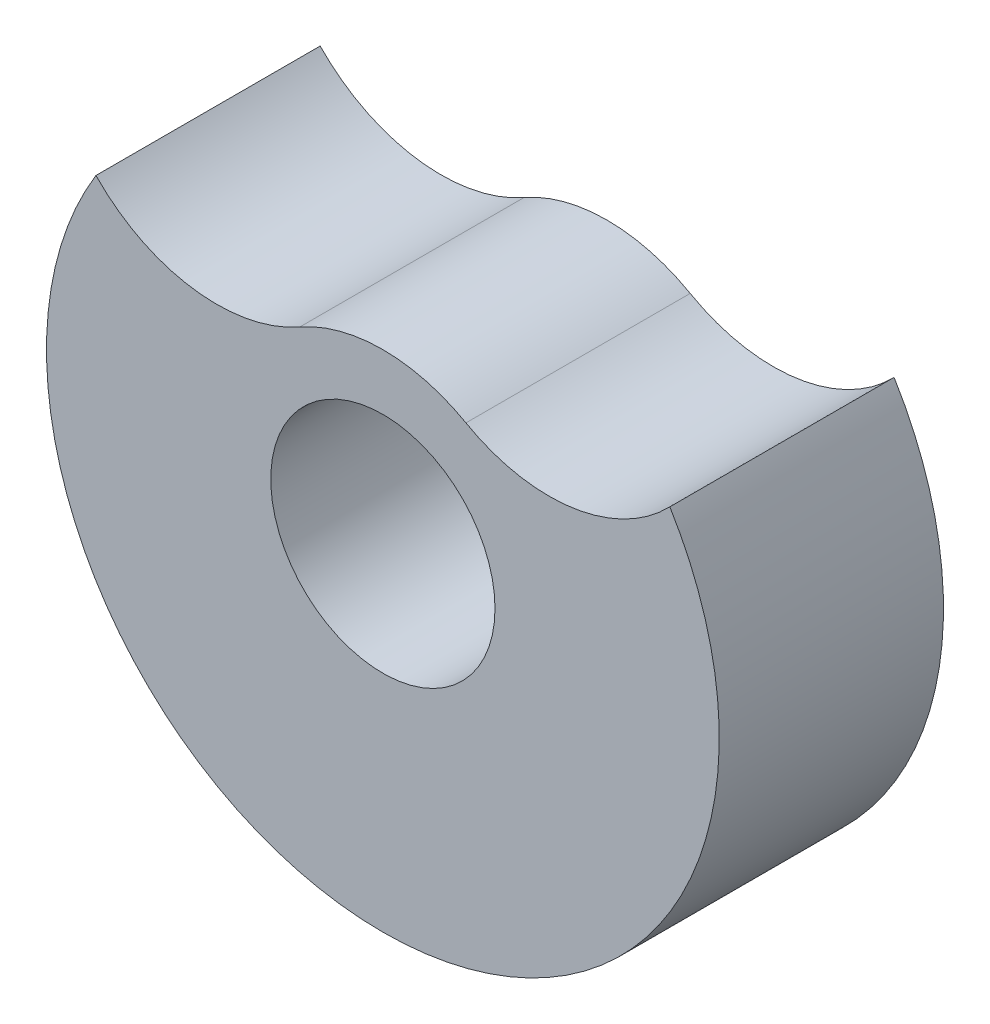
ISO-10303-21;
HEADER;
FILE_DESCRIPTION(('STEP AP214'),'2;1');
FILE_NAME('part.step','',(''),(''),'','','');
FILE_SCHEMA(('AUTOMOTIVE_DESIGN { 1 0 10303 214 1 1 1 1 }'));
ENDSEC;
DATA;
#1=APPLICATION_CONTEXT('core data for automotive mechanical design processes');
#2=APPLICATION_PROTOCOL_DEFINITION('international standard','automotive_design',2000,#1);
#3=PRODUCT_CONTEXT('',#1,'mechanical');
#4=PRODUCT('Part','Part','',(#3));
#5=PRODUCT_RELATED_PRODUCT_CATEGORY('part','',(#4));
#6=PRODUCT_DEFINITION_FORMATION('','',#4);
#7=PRODUCT_DEFINITION_CONTEXT('part definition',#1,'design');
#8=PRODUCT_DEFINITION('design','',#6,#7);
#9=PRODUCT_DEFINITION_SHAPE('','',#8);
#10=(LENGTH_UNIT() NAMED_UNIT(*) SI_UNIT(.MILLI.,.METRE.));
#11=(NAMED_UNIT(*) PLANE_ANGLE_UNIT() SI_UNIT($,.RADIAN.));
#12=(NAMED_UNIT(*) SI_UNIT($,.STERADIAN.) SOLID_ANGLE_UNIT());
#13=UNCERTAINTY_MEASURE_WITH_UNIT(LENGTH_MEASURE(1.E-05),#10,'distance_accuracy_value','');
#14=(GEOMETRIC_REPRESENTATION_CONTEXT(3) GLOBAL_UNCERTAINTY_ASSIGNED_CONTEXT((#13)) GLOBAL_UNIT_ASSIGNED_CONTEXT((#10,
#11,#12)) REPRESENTATION_CONTEXT('',''));
#15=CARTESIAN_POINT('',(0.,0.,0.));
#16=DIRECTION('',(0.,0.,1.));
#17=DIRECTION('',(1.,0.,0.));
#18=AXIS2_PLACEMENT_3D('',#15,#16,#17);
#19=CARTESIAN_POINT('',(0.,0.,10.));
#20=DIRECTION('',(0.,0.,-1.));
#21=DIRECTION('',(-1.,0.,0.));
#22=AXIS2_PLACEMENT_3D('',#19,#20,#21);
#23=CYLINDRICAL_SURFACE('',#22,15.);
#24=CARTESIAN_POINT('',(0.,0.,0.));
#25=DIRECTION('',(0.,0.,1.));
#26=DIRECTION('',(1.,0.,0.));
#27=AXIS2_PLACEMENT_3D('',#24,#25,#26);
#28=CIRCLE('',#27,15.);
#29=CARTESIAN_POINT('',(-12.7965992873332,7.82604923824424,0.));
#30=VERTEX_POINT('',#29);
#31=CARTESIAN_POINT('',(12.7965992873332,7.82604923824424,0.));
#32=VERTEX_POINT('',#31);
#33=EDGE_CURVE('E113',#30,#32,#28,.T.);
#34=ORIENTED_EDGE('',*,*,#33,.T.);
#35=DIRECTION('',(0.,0.,1.));
#36=VECTOR('',#35,1.);
#37=CARTESIAN_POINT('',(12.7965992873332,7.82604923824424,5.));
#38=LINE('',#37,#36);
#39=CARTESIAN_POINT('',(12.7965992873332,7.82604923824424,10.));
#40=VERTEX_POINT('',#39);
#41=EDGE_CURVE('E62',#32,#40,#38,.T.);
#42=ORIENTED_EDGE('',*,*,#41,.T.);
#43=CARTESIAN_POINT('',(0.,0.,10.));
#44=DIRECTION('',(0.,0.,1.));
#45=DIRECTION('',(1.,0.,0.));
#46=AXIS2_PLACEMENT_3D('',#43,#44,#45);
#47=CIRCLE('',#46,15.);
#48=CARTESIAN_POINT('',(-12.7965992873332,7.82604923824424,10.));
#49=VERTEX_POINT('',#48);
#50=EDGE_CURVE('E109',#49,#40,#47,.T.);
#51=ORIENTED_EDGE('',*,*,#50,.F.);
#52=DIRECTION('',(0.,0.,1.));
#53=VECTOR('',#52,1.);
#54=CARTESIAN_POINT('',(-12.7965992873332,7.82604923824424,5.));
#55=LINE('',#54,#53);
#56=EDGE_CURVE('E86',#49,#30,#55,.F.);
#57=ORIENTED_EDGE('',*,*,#56,.T.);
#58=EDGE_LOOP('',(#34,#42,#51,#57));
#59=FACE_BOUND('',#58,.T.);
#60=ADVANCED_FACE('F46',(#59),#23,.T.);
#61=CARTESIAN_POINT('',(0.,0.,10.));
#62=DIRECTION('',(0.,0.,1.));
#63=DIRECTION('',(1.,0.,0.));
#64=AXIS2_PLACEMENT_3D('',#61,#62,#63);
#65=PLANE('',#64);
#66=CARTESIAN_POINT('',(7.40825458062666,13.0429200744551,10.));
#67=DIRECTION('',(0.,0.,1.));
#68=DIRECTION('',(1.,0.,0.));
#69=AXIS2_PLACEMENT_3D('',#66,#67,#68);
#70=CIRCLE('',#69,7.5);
#71=CARTESIAN_POINT('',(3.70412729031333,6.52146003722756,10.));
#72=VERTEX_POINT('',#71);
#73=EDGE_CURVE('E13',#72,#40,#70,.T.);
#74=ORIENTED_EDGE('',*,*,#73,.F.);
#75=CARTESIAN_POINT('',(0.,0.,10.));
#76=DIRECTION('',(0.,0.,-1.));
#77=DIRECTION('',(1.,0.,0.));
#78=AXIS2_PLACEMENT_3D('',#75,#76,#77);
#79=CIRCLE('',#78,7.5);
#80=CARTESIAN_POINT('',(-3.70412729031333,6.52146003722756,10.));
#81=VERTEX_POINT('',#80);
#82=EDGE_CURVE('E91',#81,#72,#79,.T.);
#83=ORIENTED_EDGE('',*,*,#82,.F.);
#84=CARTESIAN_POINT('',(-7.40825458062666,13.0429200744551,10.));
#85=DIRECTION('',(0.,0.,1.));
#86=DIRECTION('',(1.,0.,0.));
#87=AXIS2_PLACEMENT_3D('',#84,#85,#86);
#88=CIRCLE('',#87,7.5);
#89=EDGE_CURVE('E81',#49,#81,#88,.T.);
#90=ORIENTED_EDGE('',*,*,#89,.F.);
#91=ORIENTED_EDGE('',*,*,#50,.T.);
#92=EDGE_LOOP('',(#74,#83,#90,#91));
#93=FACE_BOUND('',#92,.T.);
#94=CARTESIAN_POINT('',(0.,0.,10.));
#95=DIRECTION('',(0.,0.,1.));
#96=DIRECTION('',(1.,0.,0.));
#97=AXIS2_PLACEMENT_3D('',#94,#95,#96);
#98=CIRCLE('',#97,5.);
#99=CARTESIAN_POINT('',(5.,0.,10.));
#100=VERTEX_POINT('',#99);
#101=EDGE_CURVE('E120',#100,#100,#98,.T.);
#102=ORIENTED_EDGE('',*,*,#101,.F.);
#103=EDGE_LOOP('',(#102));
#104=FACE_BOUND('',#103,.T.);
#105=ADVANCED_FACE('F102',(#93,#104),#65,.T.);
#106=CARTESIAN_POINT('',(0.,0.,0.));
#107=DIRECTION('',(0.,0.,1.));
#108=DIRECTION('',(1.,0.,0.));
#109=AXIS2_PLACEMENT_3D('',#106,#107,#108);
#110=PLANE('',#109);
#111=CARTESIAN_POINT('',(0.,0.,0.));
#112=DIRECTION('',(0.,0.,1.));
#113=DIRECTION('',(1.,0.,0.));
#114=AXIS2_PLACEMENT_3D('',#111,#112,#113);
#115=CIRCLE('',#114,5.);
#116=CARTESIAN_POINT('',(5.,0.,0.));
#117=VERTEX_POINT('',#116);
#118=EDGE_CURVE('E92',#117,#117,#115,.F.);
#119=ORIENTED_EDGE('',*,*,#118,.F.);
#120=EDGE_LOOP('',(#119));
#121=FACE_BOUND('',#120,.T.);
#122=CARTESIAN_POINT('',(0.,0.,0.));
#123=DIRECTION('',(0.,0.,-1.));
#124=DIRECTION('',(1.,0.,0.));
#125=AXIS2_PLACEMENT_3D('',#122,#123,#124);
#126=CIRCLE('',#125,7.5);
#127=CARTESIAN_POINT('',(-3.70412729031333,6.52146003722756,0.));
#128=VERTEX_POINT('',#127);
#129=CARTESIAN_POINT('',(3.70412729031333,6.52146003722756,0.));
#130=VERTEX_POINT('',#129);
#131=EDGE_CURVE('E100',#128,#130,#126,.T.);
#132=ORIENTED_EDGE('',*,*,#131,.T.);
#133=CARTESIAN_POINT('',(7.40825458062666,13.0429200744551,0.));
#134=DIRECTION('',(0.,0.,1.));
#135=DIRECTION('',(1.,0.,0.));
#136=AXIS2_PLACEMENT_3D('',#133,#134,#135);
#137=CIRCLE('',#136,7.5);
#138=EDGE_CURVE('E108',#130,#32,#137,.T.);
#139=ORIENTED_EDGE('',*,*,#138,.T.);
#140=ORIENTED_EDGE('',*,*,#33,.F.);
#141=CARTESIAN_POINT('',(-7.40825458062666,13.0429200744551,0.));
#142=DIRECTION('',(0.,0.,1.));
#143=DIRECTION('',(1.,0.,0.));
#144=AXIS2_PLACEMENT_3D('',#141,#142,#143);
#145=CIRCLE('',#144,7.5);
#146=EDGE_CURVE('E111',#30,#128,#145,.T.);
#147=ORIENTED_EDGE('',*,*,#146,.T.);
#148=EDGE_LOOP('',(#132,#139,#140,#147));
#149=FACE_BOUND('',#148,.T.);
#150=ADVANCED_FACE('F126',(#121,#149),#110,.F.);
#151=CARTESIAN_POINT('',(0.,0.,-0.000999999999999265));
#152=DIRECTION('',(0.,0.,1.));
#153=DIRECTION('',(1.,0.,0.));
#154=AXIS2_PLACEMENT_3D('',#151,#152,#153);
#155=CYLINDRICAL_SURFACE('',#154,5.);
#156=ORIENTED_EDGE('',*,*,#101,.T.);
#157=EDGE_LOOP('',(#156));
#158=FACE_BOUND('',#157,.T.);
#159=ORIENTED_EDGE('',*,*,#118,.T.);
#160=EDGE_LOOP('',(#159));
#161=FACE_BOUND('',#160,.T.);
#162=ADVANCED_FACE('F143',(#158,#161),#155,.F.);
#163=CARTESIAN_POINT('',(-7.40825458062666,13.0429200744551,0.));
#164=DIRECTION('',(0.,0.,1.));
#165=DIRECTION('',(1.,0.,0.));
#166=AXIS2_PLACEMENT_3D('',#163,#164,#165);
#167=CYLINDRICAL_SURFACE('',#166,7.5);
#168=ORIENTED_EDGE('',*,*,#89,.T.);
#169=DIRECTION('',(0.,0.,1.));
#170=VECTOR('',#169,1.);
#171=CARTESIAN_POINT('',(-3.70412729031333,6.52146003722756,0.));
#172=LINE('',#171,#170);
#173=EDGE_CURVE('E83',#128,#81,#172,.T.);
#174=ORIENTED_EDGE('',*,*,#173,.F.);
#175=ORIENTED_EDGE('',*,*,#146,.F.);
#176=ORIENTED_EDGE('',*,*,#56,.F.);
#177=EDGE_LOOP('',(#168,#174,#175,#176));
#178=FACE_BOUND('',#177,.T.);
#179=ADVANCED_FACE('F48',(#178),#167,.F.);
#180=CARTESIAN_POINT('',(0.,0.,0.));
#181=DIRECTION('',(0.,0.,1.));
#182=DIRECTION('',(1.,0.,0.));
#183=AXIS2_PLACEMENT_3D('',#180,#181,#182);
#184=CYLINDRICAL_SURFACE('',#183,7.5);
#185=ORIENTED_EDGE('',*,*,#82,.T.);
#186=DIRECTION('',(0.,0.,1.));
#187=VECTOR('',#186,1.);
#188=CARTESIAN_POINT('',(3.70412729031333,6.52146003722756,0.));
#189=LINE('',#188,#187);
#190=EDGE_CURVE('E55',#130,#72,#189,.T.);
#191=ORIENTED_EDGE('',*,*,#190,.F.);
#192=ORIENTED_EDGE('',*,*,#131,.F.);
#193=ORIENTED_EDGE('',*,*,#173,.T.);
#194=EDGE_LOOP('',(#185,#191,#192,#193));
#195=FACE_BOUND('',#194,.T.);
#196=ADVANCED_FACE('F96',(#195),#184,.T.);
#197=CARTESIAN_POINT('',(7.40825458062666,13.0429200744551,0.));
#198=DIRECTION('',(0.,0.,1.));
#199=DIRECTION('',(1.,0.,0.));
#200=AXIS2_PLACEMENT_3D('',#197,#198,#199);
#201=CYLINDRICAL_SURFACE('',#200,7.5);
#202=ORIENTED_EDGE('',*,*,#138,.F.);
#203=ORIENTED_EDGE('',*,*,#190,.T.);
#204=ORIENTED_EDGE('',*,*,#73,.T.);
#205=ORIENTED_EDGE('',*,*,#41,.F.);
#206=EDGE_LOOP('',(#202,#203,#204,#205));
#207=FACE_BOUND('',#206,.T.);
#208=ADVANCED_FACE('F134',(#207),#201,.F.);
#209=CLOSED_SHELL('',(#60,#105,#150,#162,#179,#196,#208));
#210=MANIFOLD_SOLID_BREP('B2',#209);
#211=ADVANCED_BREP_SHAPE_REPRESENTATION('',(#18,#210),#14);
#212=SHAPE_DEFINITION_REPRESENTATION(#9,#211);
ENDSEC;
END-ISO-10303-21;
